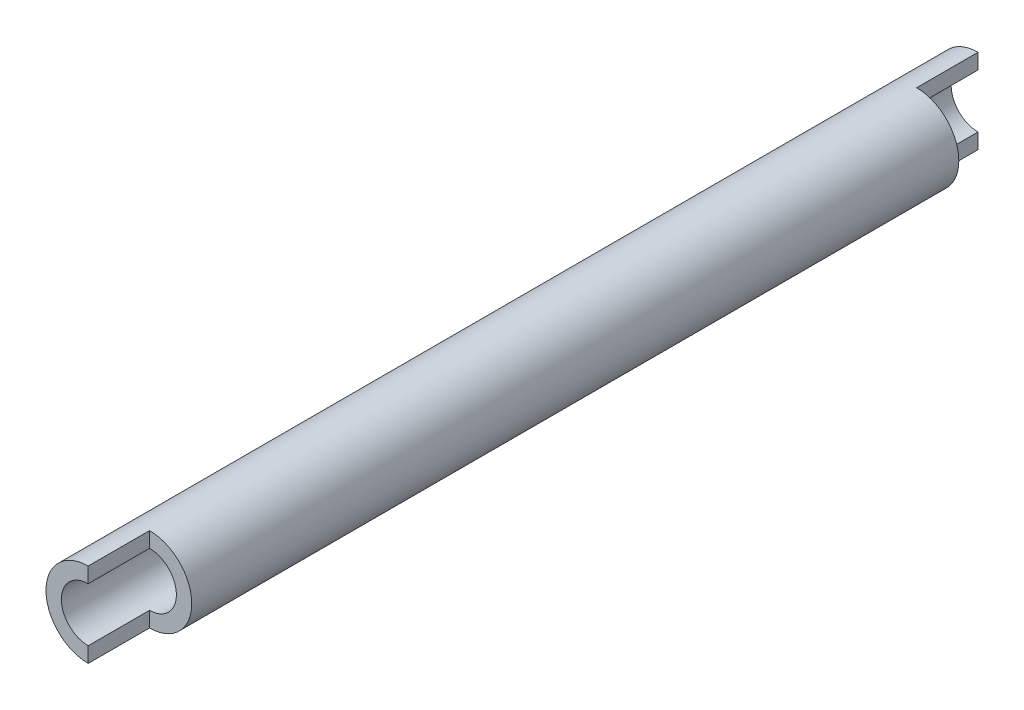
ISO-10303-21;
HEADER;
FILE_DESCRIPTION(('STEP AP214'),'2;1');
FILE_NAME('part.step','',(''),(''),'','','');
FILE_SCHEMA(('AUTOMOTIVE_DESIGN { 1 0 10303 214 1 1 1 1 }'));
ENDSEC;
DATA;
#1=APPLICATION_CONTEXT('core data for automotive mechanical design processes');
#2=APPLICATION_PROTOCOL_DEFINITION('international standard','automotive_design',2000,#1);
#3=PRODUCT_CONTEXT('',#1,'mechanical');
#4=PRODUCT('Part','Part','',(#3));
#5=PRODUCT_RELATED_PRODUCT_CATEGORY('part','',(#4));
#6=PRODUCT_DEFINITION_FORMATION('','',#4);
#7=PRODUCT_DEFINITION_CONTEXT('part definition',#1,'design');
#8=PRODUCT_DEFINITION('design','',#6,#7);
#9=PRODUCT_DEFINITION_SHAPE('','',#8);
#10=(LENGTH_UNIT() NAMED_UNIT(*) SI_UNIT(.MILLI.,.METRE.));
#11=(NAMED_UNIT(*) PLANE_ANGLE_UNIT() SI_UNIT($,.RADIAN.));
#12=(NAMED_UNIT(*) SI_UNIT($,.STERADIAN.) SOLID_ANGLE_UNIT());
#13=UNCERTAINTY_MEASURE_WITH_UNIT(LENGTH_MEASURE(1.E-05),#10,'distance_accuracy_value','');
#14=(GEOMETRIC_REPRESENTATION_CONTEXT(3) GLOBAL_UNCERTAINTY_ASSIGNED_CONTEXT((#13)) GLOBAL_UNIT_ASSIGNED_CONTEXT((#10,
#11,#12)) REPRESENTATION_CONTEXT('',''));
#15=CARTESIAN_POINT('',(0.,0.,0.));
#16=DIRECTION('',(0.,0.,1.));
#17=DIRECTION('',(1.,0.,0.));
#18=AXIS2_PLACEMENT_3D('',#15,#16,#17);
#19=CARTESIAN_POINT('',(0.,0.,100.));
#20=DIRECTION('',(0.,0.,1.));
#21=DIRECTION('',(1.,0.,0.));
#22=AXIS2_PLACEMENT_3D('',#19,#20,#21);
#23=PLANE('',#22);
#24=DIRECTION('',(0.,1.,0.));
#25=VECTOR('',#24,1.);
#26=CARTESIAN_POINT('',(0.,0.,100.));
#27=LINE('',#26,#25);
#28=CARTESIAN_POINT('',(0.,-5.5,100.));
#29=VERTEX_POINT('',#28);
#30=CARTESIAN_POINT('',(0.,-3.5,100.));
#31=VERTEX_POINT('',#30);
#32=EDGE_CURVE('E154',#29,#31,#27,.T.);
#33=ORIENTED_EDGE('',*,*,#32,.F.);
#34=CARTESIAN_POINT('',(0.,0.,100.));
#35=DIRECTION('',(0.,0.,1.));
#36=DIRECTION('',(1.,0.,0.));
#37=AXIS2_PLACEMENT_3D('',#34,#35,#36);
#38=CIRCLE('',#37,5.5);
#39=CARTESIAN_POINT('',(0.,5.5,100.));
#40=VERTEX_POINT('',#39);
#41=EDGE_CURVE('E12',#29,#40,#38,.T.);
#42=ORIENTED_EDGE('',*,*,#41,.T.);
#43=DIRECTION('',(0.,1.,0.));
#44=VECTOR('',#43,1.);
#45=CARTESIAN_POINT('',(0.,0.,100.));
#46=LINE('',#45,#44);
#47=CARTESIAN_POINT('',(0.,3.5,100.));
#48=VERTEX_POINT('',#47);
#49=EDGE_CURVE('E150',#48,#40,#46,.T.);
#50=ORIENTED_EDGE('',*,*,#49,.F.);
#51=CARTESIAN_POINT('',(0.,0.,100.));
#52=DIRECTION('',(0.,0.,1.));
#53=DIRECTION('',(1.,0.,0.));
#54=AXIS2_PLACEMENT_3D('',#51,#52,#53);
#55=CIRCLE('',#54,3.5);
#56=EDGE_CURVE('E157',#31,#48,#55,.T.);
#57=ORIENTED_EDGE('',*,*,#56,.F.);
#58=EDGE_LOOP('',(#33,#42,#50,#57));
#59=FACE_BOUND('',#58,.T.);
#60=ADVANCED_FACE('F36',(#59),#23,.T.);
#61=CARTESIAN_POINT('',(0.,0.,0.));
#62=DIRECTION('',(0.,0.,1.));
#63=DIRECTION('',(1.,0.,0.));
#64=AXIS2_PLACEMENT_3D('',#61,#62,#63);
#65=PLANE('',#64);
#66=CARTESIAN_POINT('',(0.,0.,0.));
#67=DIRECTION('',(0.,0.,1.));
#68=DIRECTION('',(1.,0.,0.));
#69=AXIS2_PLACEMENT_3D('',#66,#67,#68);
#70=CIRCLE('',#69,5.5);
#71=CARTESIAN_POINT('',(0.,-5.5,0.));
#72=VERTEX_POINT('',#71);
#73=CARTESIAN_POINT('',(0.,5.5,0.));
#74=VERTEX_POINT('',#73);
#75=EDGE_CURVE('E40',#72,#74,#70,.T.);
#76=ORIENTED_EDGE('',*,*,#75,.F.);
#77=DIRECTION('',(0.,1.,0.));
#78=VECTOR('',#77,1.);
#79=CARTESIAN_POINT('',(0.,0.,0.));
#80=LINE('',#79,#78);
#81=CARTESIAN_POINT('',(0.,-3.5,0.));
#82=VERTEX_POINT('',#81);
#83=EDGE_CURVE('E152',#72,#82,#80,.T.);
#84=ORIENTED_EDGE('',*,*,#83,.T.);
#85=CARTESIAN_POINT('',(0.,0.,0.));
#86=DIRECTION('',(0.,0.,1.));
#87=DIRECTION('',(1.,0.,0.));
#88=AXIS2_PLACEMENT_3D('',#85,#86,#87);
#89=CIRCLE('',#88,3.5);
#90=CARTESIAN_POINT('',(0.,3.5,0.));
#91=VERTEX_POINT('',#90);
#92=EDGE_CURVE('E106',#82,#91,#89,.T.);
#93=ORIENTED_EDGE('',*,*,#92,.T.);
#94=DIRECTION('',(0.,1.,0.));
#95=VECTOR('',#94,1.);
#96=CARTESIAN_POINT('',(0.,0.,0.));
#97=LINE('',#96,#95);
#98=EDGE_CURVE('E55',#91,#74,#97,.T.);
#99=ORIENTED_EDGE('',*,*,#98,.T.);
#100=EDGE_LOOP('',(#76,#84,#93,#99));
#101=FACE_BOUND('',#100,.T.);
#102=ADVANCED_FACE('F160',(#101),#65,.F.);
#103=CARTESIAN_POINT('',(0.,0.,100.));
#104=DIRECTION('',(0.,0.,-1.));
#105=DIRECTION('',(-1.,0.,0.));
#106=AXIS2_PLACEMENT_3D('',#103,#104,#105);
#107=CYLINDRICAL_SURFACE('',#106,5.5);
#108=ORIENTED_EDGE('',*,*,#75,.T.);
#109=DIRECTION('',(0.,0.,-1.));
#110=VECTOR('',#109,1.);
#111=CARTESIAN_POINT('',(0.,5.5,128.298373876249));
#112=LINE('',#111,#110);
#113=CARTESIAN_POINT('',(0.,5.5,-8.));
#114=VERTEX_POINT('',#113);
#115=EDGE_CURVE('E143',#74,#114,#112,.T.);
#116=ORIENTED_EDGE('',*,*,#115,.T.);
#117=CARTESIAN_POINT('',(0.,0.,-8.));
#118=DIRECTION('',(0.,0.,-1.));
#119=DIRECTION('',(-1.,0.,0.));
#120=AXIS2_PLACEMENT_3D('',#117,#118,#119);
#121=CIRCLE('',#120,5.5);
#122=CARTESIAN_POINT('',(0.,-5.5,-8.));
#123=VERTEX_POINT('',#122);
#124=EDGE_CURVE('E119',#123,#114,#121,.T.);
#125=ORIENTED_EDGE('',*,*,#124,.F.);
#126=DIRECTION('',(0.,0.,-1.));
#127=VECTOR('',#126,1.);
#128=CARTESIAN_POINT('',(0.,-5.5,128.298373876249));
#129=LINE('',#128,#127);
#130=EDGE_CURVE('E115',#72,#123,#129,.T.);
#131=ORIENTED_EDGE('',*,*,#130,.F.);
#132=EDGE_LOOP('',(#108,#116,#125,#131));
#133=FACE_BOUND('',#132,.T.);
#134=ORIENTED_EDGE('',*,*,#41,.F.);
#135=CARTESIAN_POINT('',(0.,-5.5,108.));
#136=VERTEX_POINT('',#135);
#137=EDGE_CURVE('E144',#136,#29,#129,.T.);
#138=ORIENTED_EDGE('',*,*,#137,.F.);
#139=CARTESIAN_POINT('',(0.,0.,108.));
#140=DIRECTION('',(0.,0.,1.));
#141=DIRECTION('',(1.,0.,0.));
#142=AXIS2_PLACEMENT_3D('',#139,#140,#141);
#143=CIRCLE('',#142,5.5);
#144=CARTESIAN_POINT('',(0.,5.5,108.));
#145=VERTEX_POINT('',#144);
#146=EDGE_CURVE('E140',#136,#145,#143,.F.);
#147=ORIENTED_EDGE('',*,*,#146,.T.);
#148=EDGE_CURVE('E139',#145,#40,#112,.T.);
#149=ORIENTED_EDGE('',*,*,#148,.T.);
#150=EDGE_LOOP('',(#134,#138,#147,#149));
#151=FACE_BOUND('',#150,.T.);
#152=ADVANCED_FACE('F38',(#133,#151),#107,.T.);
#153=CARTESIAN_POINT('',(0.,0.,100.));
#154=DIRECTION('',(0.,0.,-1.));
#155=DIRECTION('',(-1.,0.,0.));
#156=AXIS2_PLACEMENT_3D('',#153,#154,#155);
#157=CYLINDRICAL_SURFACE('',#156,3.5);
#158=ORIENTED_EDGE('',*,*,#92,.F.);
#159=DIRECTION('',(0.,0.,-1.));
#160=VECTOR('',#159,1.);
#161=CARTESIAN_POINT('',(0.,-3.5,128.298373876249));
#162=LINE('',#161,#160);
#163=CARTESIAN_POINT('',(0.,-3.5,-8.));
#164=VERTEX_POINT('',#163);
#165=EDGE_CURVE('E99',#82,#164,#162,.T.);
#166=ORIENTED_EDGE('',*,*,#165,.T.);
#167=CARTESIAN_POINT('',(0.,0.,-8.));
#168=DIRECTION('',(0.,0.,1.));
#169=DIRECTION('',(-1.,0.,0.));
#170=AXIS2_PLACEMENT_3D('',#167,#168,#169);
#171=CIRCLE('',#170,3.5);
#172=CARTESIAN_POINT('',(0.,3.5,-8.));
#173=VERTEX_POINT('',#172);
#174=EDGE_CURVE('E105',#173,#164,#171,.T.);
#175=ORIENTED_EDGE('',*,*,#174,.F.);
#176=DIRECTION('',(0.,0.,-1.));
#177=VECTOR('',#176,1.);
#178=CARTESIAN_POINT('',(0.,3.5,128.298373876249));
#179=LINE('',#178,#177);
#180=EDGE_CURVE('E138',#91,#173,#179,.T.);
#181=ORIENTED_EDGE('',*,*,#180,.F.);
#182=EDGE_LOOP('',(#158,#166,#175,#181));
#183=FACE_BOUND('',#182,.T.);
#184=ORIENTED_EDGE('',*,*,#56,.T.);
#185=CARTESIAN_POINT('',(0.,3.5,108.));
#186=VERTEX_POINT('',#185);
#187=EDGE_CURVE('E134',#186,#48,#179,.T.);
#188=ORIENTED_EDGE('',*,*,#187,.F.);
#189=CARTESIAN_POINT('',(0.,0.,108.));
#190=DIRECTION('',(0.,0.,1.));
#191=DIRECTION('',(1.,0.,0.));
#192=AXIS2_PLACEMENT_3D('',#189,#190,#191);
#193=CIRCLE('',#192,3.5);
#194=CARTESIAN_POINT('',(0.,-3.5,108.));
#195=VERTEX_POINT('',#194);
#196=EDGE_CURVE('E109',#186,#195,#193,.T.);
#197=ORIENTED_EDGE('',*,*,#196,.T.);
#198=EDGE_CURVE('E108',#195,#31,#162,.T.);
#199=ORIENTED_EDGE('',*,*,#198,.T.);
#200=EDGE_LOOP('',(#184,#188,#197,#199));
#201=FACE_BOUND('',#200,.T.);
#202=ADVANCED_FACE('F101',(#183,#201),#157,.F.);
#203=CARTESIAN_POINT('',(0.,0.,-8.));
#204=DIRECTION('',(0.,0.,-1.));
#205=DIRECTION('',(-1.,0.,0.));
#206=AXIS2_PLACEMENT_3D('',#203,#204,#205);
#207=PLANE('',#206);
#208=ORIENTED_EDGE('',*,*,#174,.T.);
#209=DIRECTION('',(0.,-1.,0.));
#210=VECTOR('',#209,1.);
#211=CARTESIAN_POINT('',(0.,-3.5,-8.));
#212=LINE('',#211,#210);
#213=EDGE_CURVE('E112',#164,#123,#212,.T.);
#214=ORIENTED_EDGE('',*,*,#213,.T.);
#215=ORIENTED_EDGE('',*,*,#124,.T.);
#216=DIRECTION('',(0.,-1.,0.));
#217=VECTOR('',#216,1.);
#218=CARTESIAN_POINT('',(0.,5.5,-8.));
#219=LINE('',#218,#217);
#220=EDGE_CURVE('E124',#114,#173,#219,.T.);
#221=ORIENTED_EDGE('',*,*,#220,.T.);
#222=EDGE_LOOP('',(#208,#214,#215,#221));
#223=FACE_BOUND('',#222,.T.);
#224=ADVANCED_FACE('F122',(#223),#207,.T.);
#225=CARTESIAN_POINT('',(0.,5.5,128.298373876249));
#226=DIRECTION('',(1.,0.,0.));
#227=DIRECTION('',(0.,0.,-1.));
#228=AXIS2_PLACEMENT_3D('',#225,#226,#227);
#229=PLANE('',#228);
#230=ORIENTED_EDGE('',*,*,#98,.F.);
#231=ORIENTED_EDGE('',*,*,#180,.T.);
#232=ORIENTED_EDGE('',*,*,#220,.F.);
#233=ORIENTED_EDGE('',*,*,#115,.F.);
#234=EDGE_LOOP('',(#230,#231,#232,#233));
#235=FACE_BOUND('',#234,.T.);
#236=ADVANCED_FACE('F163',(#235),#229,.T.);
#237=CARTESIAN_POINT('',(0.,-3.5,128.298373876249));
#238=DIRECTION('',(1.,0.,0.));
#239=DIRECTION('',(0.,0.,-1.));
#240=AXIS2_PLACEMENT_3D('',#237,#238,#239);
#241=PLANE('',#240);
#242=ORIENTED_EDGE('',*,*,#83,.F.);
#243=ORIENTED_EDGE('',*,*,#130,.T.);
#244=ORIENTED_EDGE('',*,*,#213,.F.);
#245=ORIENTED_EDGE('',*,*,#165,.F.);
#246=EDGE_LOOP('',(#242,#243,#244,#245));
#247=FACE_BOUND('',#246,.T.);
#248=ADVANCED_FACE('F113',(#247),#241,.T.);
#249=CARTESIAN_POINT('',(0.,0.,108.));
#250=DIRECTION('',(0.,0.,1.));
#251=DIRECTION('',(1.,0.,0.));
#252=AXIS2_PLACEMENT_3D('',#249,#250,#251);
#253=PLANE('',#252);
#254=ORIENTED_EDGE('',*,*,#196,.F.);
#255=DIRECTION('',(0.,-1.,0.));
#256=VECTOR('',#255,1.);
#257=CARTESIAN_POINT('',(0.,5.5,108.));
#258=LINE('',#257,#256);
#259=EDGE_CURVE('E135',#145,#186,#258,.T.);
#260=ORIENTED_EDGE('',*,*,#259,.F.);
#261=ORIENTED_EDGE('',*,*,#146,.F.);
#262=DIRECTION('',(0.,-1.,0.));
#263=VECTOR('',#262,1.);
#264=CARTESIAN_POINT('',(0.,-3.5,108.));
#265=LINE('',#264,#263);
#266=EDGE_CURVE('E129',#195,#136,#265,.T.);
#267=ORIENTED_EDGE('',*,*,#266,.F.);
#268=EDGE_LOOP('',(#254,#260,#261,#267));
#269=FACE_BOUND('',#268,.T.);
#270=ADVANCED_FACE('F178',(#269),#253,.T.);
#271=ORIENTED_EDGE('',*,*,#137,.T.);
#272=ORIENTED_EDGE('',*,*,#32,.T.);
#273=ORIENTED_EDGE('',*,*,#198,.F.);
#274=ORIENTED_EDGE('',*,*,#266,.T.);
#275=EDGE_LOOP('',(#271,#272,#273,#274));
#276=FACE_BOUND('',#275,.T.);
#277=ADVANCED_FACE('F176',(#276),#241,.T.);
#278=ORIENTED_EDGE('',*,*,#187,.T.);
#279=ORIENTED_EDGE('',*,*,#49,.T.);
#280=ORIENTED_EDGE('',*,*,#148,.F.);
#281=ORIENTED_EDGE('',*,*,#259,.T.);
#282=EDGE_LOOP('',(#278,#279,#280,#281));
#283=FACE_BOUND('',#282,.T.);
#284=ADVANCED_FACE('F181',(#283),#229,.T.);
#285=CLOSED_SHELL('',(#60,#102,#152,#202,#224,#236,#248,#270,#277,#284));
#286=MANIFOLD_SOLID_BREP('B2',#285);
#287=ADVANCED_BREP_SHAPE_REPRESENTATION('',(#18,#286),#14);
#288=SHAPE_DEFINITION_REPRESENTATION(#9,#287);
ENDSEC;
END-ISO-10303-21;
